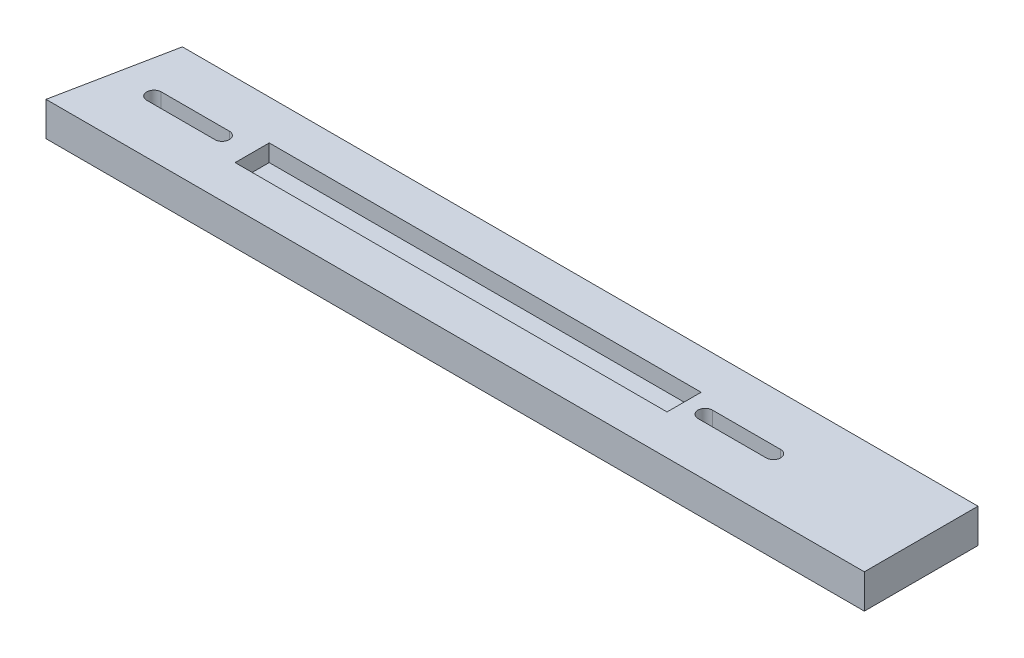
ISO-10303-21;
HEADER;
FILE_DESCRIPTION(('STEP AP214'),'2;1');
FILE_NAME('part.step','',(''),(''),'','','');
FILE_SCHEMA(('AUTOMOTIVE_DESIGN { 1 0 10303 214 1 1 1 1 }'));
ENDSEC;
DATA;
#1=APPLICATION_CONTEXT('core data for automotive mechanical design processes');
#2=APPLICATION_PROTOCOL_DEFINITION('international standard','automotive_design',2000,#1);
#3=PRODUCT_CONTEXT('',#1,'mechanical');
#4=PRODUCT('Part','Part','',(#3));
#5=PRODUCT_RELATED_PRODUCT_CATEGORY('part','',(#4));
#6=PRODUCT_DEFINITION_FORMATION('','',#4);
#7=PRODUCT_DEFINITION_CONTEXT('part definition',#1,'design');
#8=PRODUCT_DEFINITION('design','',#6,#7);
#9=PRODUCT_DEFINITION_SHAPE('','',#8);
#10=(LENGTH_UNIT() NAMED_UNIT(*) SI_UNIT(.MILLI.,.METRE.));
#11=(NAMED_UNIT(*) PLANE_ANGLE_UNIT() SI_UNIT($,.RADIAN.));
#12=(NAMED_UNIT(*) SI_UNIT($,.STERADIAN.) SOLID_ANGLE_UNIT());
#13=UNCERTAINTY_MEASURE_WITH_UNIT(LENGTH_MEASURE(1.E-05),#10,'distance_accuracy_value','');
#14=(GEOMETRIC_REPRESENTATION_CONTEXT(3) GLOBAL_UNCERTAINTY_ASSIGNED_CONTEXT((#13)) GLOBAL_UNIT_ASSIGNED_CONTEXT((#10,
#11,#12)) REPRESENTATION_CONTEXT('',''));
#15=CARTESIAN_POINT('',(0.,0.,0.));
#16=DIRECTION('',(0.,0.,1.));
#17=DIRECTION('',(1.,0.,0.));
#18=AXIS2_PLACEMENT_3D('',#15,#16,#17);
#19=CARTESIAN_POINT('',(228.6,19.05,31.75));
#20=DIRECTION('',(0.,0.,-1.));
#21=DIRECTION('',(-1.,0.,0.));
#22=AXIS2_PLACEMENT_3D('',#19,#20,#21);
#23=PLANE('',#22);
#24=DIRECTION('',(1.,0.,0.));
#25=VECTOR('',#24,1.);
#26=CARTESIAN_POINT('',(228.6,0.,31.75));
#27=LINE('',#26,#25);
#28=CARTESIAN_POINT('',(-228.6,0.,31.75));
#29=VERTEX_POINT('',#28);
#30=CARTESIAN_POINT('',(228.6,0.,31.75));
#31=VERTEX_POINT('',#30);
#32=EDGE_CURVE('E256',#29,#31,#27,.T.);
#33=ORIENTED_EDGE('',*,*,#32,.T.);
#34=DIRECTION('',(0.,-1.,0.));
#35=VECTOR('',#34,1.);
#36=CARTESIAN_POINT('',(228.6,19.05,31.75));
#37=LINE('',#36,#35);
#38=CARTESIAN_POINT('',(228.6,19.05,31.75));
#39=VERTEX_POINT('',#38);
#40=EDGE_CURVE('E42',#39,#31,#37,.T.);
#41=ORIENTED_EDGE('',*,*,#40,.F.);
#42=DIRECTION('',(1.,0.,0.));
#43=VECTOR('',#42,1.);
#44=CARTESIAN_POINT('',(228.6,19.05,31.75));
#45=LINE('',#44,#43);
#46=CARTESIAN_POINT('',(-228.6,19.05,31.75));
#47=VERTEX_POINT('',#46);
#48=EDGE_CURVE('E264',#47,#39,#45,.T.);
#49=ORIENTED_EDGE('',*,*,#48,.F.);
#50=DIRECTION('',(0.,-1.,0.));
#51=VECTOR('',#50,1.);
#52=CARTESIAN_POINT('',(-228.6,19.05,31.75));
#53=LINE('',#52,#51);
#54=EDGE_CURVE('E11',#47,#29,#53,.T.);
#55=ORIENTED_EDGE('',*,*,#54,.T.);
#56=EDGE_LOOP('',(#33,#41,#49,#55));
#57=FACE_BOUND('',#56,.T.);
#58=ADVANCED_FACE('F35',(#57),#23,.F.);
#59=CARTESIAN_POINT('',(228.6,19.05,31.75));
#60=DIRECTION('',(-1.,0.,0.));
#61=DIRECTION('',(0.,0.,1.));
#62=AXIS2_PLACEMENT_3D('',#59,#60,#61);
#63=PLANE('',#62);
#64=DIRECTION('',(0.,0.,-1.));
#65=VECTOR('',#64,1.);
#66=CARTESIAN_POINT('',(228.6,0.,31.75));
#67=LINE('',#66,#65);
#68=CARTESIAN_POINT('',(228.6,0.,-31.75));
#69=VERTEX_POINT('',#68);
#70=EDGE_CURVE('E276',#31,#69,#67,.T.);
#71=ORIENTED_EDGE('',*,*,#70,.T.);
#72=DIRECTION('',(0.,-1.,0.));
#73=VECTOR('',#72,1.);
#74=CARTESIAN_POINT('',(228.6,19.05,-31.75));
#75=LINE('',#74,#73);
#76=CARTESIAN_POINT('',(228.6,19.05,-31.75));
#77=VERTEX_POINT('',#76);
#78=EDGE_CURVE('E273',#77,#69,#75,.T.);
#79=ORIENTED_EDGE('',*,*,#78,.F.);
#80=DIRECTION('',(0.,0.,-1.));
#81=VECTOR('',#80,1.);
#82=CARTESIAN_POINT('',(228.6,19.05,31.75));
#83=LINE('',#82,#81);
#84=EDGE_CURVE('E267',#39,#77,#83,.T.);
#85=ORIENTED_EDGE('',*,*,#84,.F.);
#86=ORIENTED_EDGE('',*,*,#40,.T.);
#87=EDGE_LOOP('',(#71,#79,#85,#86));
#88=FACE_BOUND('',#87,.T.);
#89=ADVANCED_FACE('F286',(#88),#63,.F.);
#90=CARTESIAN_POINT('',(228.6,19.05,-31.75));
#91=DIRECTION('',(0.,0.,1.));
#92=DIRECTION('',(1.,0.,0.));
#93=AXIS2_PLACEMENT_3D('',#90,#91,#92);
#94=PLANE('',#93);
#95=DIRECTION('',(-1.,0.,0.));
#96=VECTOR('',#95,1.);
#97=CARTESIAN_POINT('',(228.6,0.,-31.75));
#98=LINE('',#97,#96);
#99=CARTESIAN_POINT('',(-215.9,0.,-31.75));
#100=VERTEX_POINT('',#99);
#101=EDGE_CURVE('E268',#69,#100,#98,.T.);
#102=ORIENTED_EDGE('',*,*,#101,.T.);
#103=DIRECTION('',(0.,1.,0.));
#104=VECTOR('',#103,1.);
#105=CARTESIAN_POINT('',(-215.9,0.,-31.75));
#106=LINE('',#105,#104);
#107=CARTESIAN_POINT('',(-215.9,19.05,-31.75));
#108=VERTEX_POINT('',#107);
#109=EDGE_CURVE('E57',#100,#108,#106,.T.);
#110=ORIENTED_EDGE('',*,*,#109,.T.);
#111=DIRECTION('',(-1.,0.,0.));
#112=VECTOR('',#111,1.);
#113=CARTESIAN_POINT('',(228.6,19.05,-31.75));
#114=LINE('',#113,#112);
#115=EDGE_CURVE('E270',#77,#108,#114,.T.);
#116=ORIENTED_EDGE('',*,*,#115,.F.);
#117=ORIENTED_EDGE('',*,*,#78,.T.);
#118=EDGE_LOOP('',(#102,#110,#116,#117));
#119=FACE_BOUND('',#118,.T.);
#120=ADVANCED_FACE('F295',(#119),#94,.F.);
#121=CARTESIAN_POINT('',(0.,19.05,0.));
#122=DIRECTION('',(0.,1.,0.));
#123=DIRECTION('',(0.,0.,1.));
#124=AXIS2_PLACEMENT_3D('',#121,#122,#123);
#125=PLANE('',#124);
#126=DIRECTION('',(0.,0.,1.));
#127=VECTOR('',#126,1.);
#128=CARTESIAN_POINT('',(-145.161,19.05,-9.52499999999999));
#129=LINE('',#128,#127);
#130=CARTESIAN_POINT('',(-145.161,19.05,-9.52499999999999));
#131=VERTEX_POINT('',#130);
#132=CARTESIAN_POINT('',(-145.161,19.05,9.52500000000001));
#133=VERTEX_POINT('',#132);
#134=EDGE_CURVE('E49',#131,#133,#129,.T.);
#135=ORIENTED_EDGE('',*,*,#134,.F.);
#136=DIRECTION('',(-1.,0.,0.));
#137=VECTOR('',#136,1.);
#138=CARTESIAN_POINT('',(-145.161,19.05,-9.52499999999999));
#139=LINE('',#138,#137);
#140=CARTESIAN_POINT('',(96.139,19.05,-9.52499999999999));
#141=VERTEX_POINT('',#140);
#142=EDGE_CURVE('E167',#141,#131,#139,.T.);
#143=ORIENTED_EDGE('',*,*,#142,.F.);
#144=DIRECTION('',(0.,0.,-1.));
#145=VECTOR('',#144,1.);
#146=CARTESIAN_POINT('',(96.139,19.05,-9.52499999999999));
#147=LINE('',#146,#145);
#148=CARTESIAN_POINT('',(96.139,19.05,9.52500000000001));
#149=VERTEX_POINT('',#148);
#150=EDGE_CURVE('E170',#149,#141,#147,.T.);
#151=ORIENTED_EDGE('',*,*,#150,.F.);
#152=DIRECTION('',(1.,0.,0.));
#153=VECTOR('',#152,1.);
#154=CARTESIAN_POINT('',(-145.161,19.05,9.52500000000001));
#155=LINE('',#154,#153);
#156=EDGE_CURVE('E176',#133,#149,#155,.T.);
#157=ORIENTED_EDGE('',*,*,#156,.F.);
#158=EDGE_LOOP('',(#135,#143,#151,#157));
#159=FACE_BOUND('',#158,.T.);
#160=DIRECTION('',(0.196116135138184,0.,-0.98058067569092));
#161=VECTOR('',#160,1.);
#162=CARTESIAN_POINT('',(-228.6,19.05,31.75));
#163=LINE('',#162,#161);
#164=EDGE_CURVE('E182',#47,#108,#163,.T.);
#165=ORIENTED_EDGE('',*,*,#164,.F.);
#166=ORIENTED_EDGE('',*,*,#48,.T.);
#167=ORIENTED_EDGE('',*,*,#84,.T.);
#168=ORIENTED_EDGE('',*,*,#115,.T.);
#169=EDGE_LOOP('',(#165,#166,#167,#168));
#170=FACE_BOUND('',#169,.T.);
#171=CARTESIAN_POINT('',(-200.025,19.05,0.));
#172=DIRECTION('',(0.,1.,0.));
#173=DIRECTION('',(0.,0.,1.));
#174=AXIS2_PLACEMENT_3D('',#171,#172,#173);
#175=CIRCLE('',#174,4.064);
#176=CARTESIAN_POINT('',(-200.025,19.05,-4.06399999999998));
#177=VERTEX_POINT('',#176);
#178=CARTESIAN_POINT('',(-200.025,19.05,4.06400000000003));
#179=VERTEX_POINT('',#178);
#180=EDGE_CURVE('E192',#177,#179,#175,.T.);
#181=ORIENTED_EDGE('',*,*,#180,.F.);
#182=DIRECTION('',(-1.,0.,0.));
#183=VECTOR('',#182,1.);
#184=CARTESIAN_POINT('',(-200.025,19.05,-4.06399999999998));
#185=LINE('',#184,#183);
#186=CARTESIAN_POINT('',(-161.925,19.05,-4.06399999999999));
#187=VERTEX_POINT('',#186);
#188=EDGE_CURVE('E197',#187,#177,#185,.T.);
#189=ORIENTED_EDGE('',*,*,#188,.F.);
#190=CARTESIAN_POINT('',(-161.925,19.05,0.));
#191=DIRECTION('',(0.,1.,0.));
#192=DIRECTION('',(0.,0.,1.));
#193=AXIS2_PLACEMENT_3D('',#190,#191,#192);
#194=CIRCLE('',#193,4.064);
#195=CARTESIAN_POINT('',(-161.925,19.05,4.06400000000002));
#196=VERTEX_POINT('',#195);
#197=EDGE_CURVE('E212',#196,#187,#194,.T.);
#198=ORIENTED_EDGE('',*,*,#197,.F.);
#199=DIRECTION('',(1.,0.,0.));
#200=VECTOR('',#199,1.);
#201=CARTESIAN_POINT('',(-200.025,19.05,4.06400000000003));
#202=LINE('',#201,#200);
#203=EDGE_CURVE('E209',#179,#196,#202,.T.);
#204=ORIENTED_EDGE('',*,*,#203,.F.);
#205=EDGE_LOOP('',(#181,#189,#198,#204));
#206=FACE_BOUND('',#205,.T.);
#207=CARTESIAN_POINT('',(146.05,19.05,0.));
#208=DIRECTION('',(0.,1.,0.));
#209=DIRECTION('',(0.,0.,1.));
#210=AXIS2_PLACEMENT_3D('',#207,#208,#209);
#211=CIRCLE('',#210,4.064);
#212=CARTESIAN_POINT('',(146.05,19.05,4.064));
#213=VERTEX_POINT('',#212);
#214=CARTESIAN_POINT('',(146.05,19.05,-4.064));
#215=VERTEX_POINT('',#214);
#216=EDGE_CURVE('E220',#213,#215,#211,.T.);
#217=ORIENTED_EDGE('',*,*,#216,.F.);
#218=DIRECTION('',(1.,0.,0.));
#219=VECTOR('',#218,1.);
#220=CARTESIAN_POINT('',(146.05,19.05,4.064));
#221=LINE('',#220,#219);
#222=CARTESIAN_POINT('',(107.95,19.05,4.064));
#223=VERTEX_POINT('',#222);
#224=EDGE_CURVE('E231',#223,#213,#221,.T.);
#225=ORIENTED_EDGE('',*,*,#224,.F.);
#226=CARTESIAN_POINT('',(107.95,19.05,0.));
#227=DIRECTION('',(0.,1.,0.));
#228=DIRECTION('',(0.,0.,1.));
#229=AXIS2_PLACEMENT_3D('',#226,#227,#228);
#230=CIRCLE('',#229,4.064);
#231=CARTESIAN_POINT('',(107.95,19.05,-4.06399999999999));
#232=VERTEX_POINT('',#231);
#233=EDGE_CURVE('E248',#232,#223,#230,.T.);
#234=ORIENTED_EDGE('',*,*,#233,.F.);
#235=DIRECTION('',(-1.,0.,0.));
#236=VECTOR('',#235,1.);
#237=CARTESIAN_POINT('',(146.05,19.05,-4.064));
#238=LINE('',#237,#236);
#239=EDGE_CURVE('E244',#215,#232,#238,.T.);
#240=ORIENTED_EDGE('',*,*,#239,.F.);
#241=EDGE_LOOP('',(#217,#225,#234,#240));
#242=FACE_BOUND('',#241,.T.);
#243=ADVANCED_FACE('F299',(#159,#170,#206,#242),#125,.T.);
#244=CARTESIAN_POINT('',(0.,0.,0.));
#245=DIRECTION('',(0.,1.,0.));
#246=DIRECTION('',(0.,0.,1.));
#247=AXIS2_PLACEMENT_3D('',#244,#245,#246);
#248=PLANE('',#247);
#249=DIRECTION('',(-1.,0.,0.));
#250=VECTOR('',#249,1.);
#251=CARTESIAN_POINT('',(-200.025,0.,-4.06399999999998));
#252=LINE('',#251,#250);
#253=CARTESIAN_POINT('',(-161.925,0.,-4.06399999999999));
#254=VERTEX_POINT('',#253);
#255=CARTESIAN_POINT('',(-200.025,0.,-4.06399999999998));
#256=VERTEX_POINT('',#255);
#257=EDGE_CURVE('E203',#254,#256,#252,.T.);
#258=ORIENTED_EDGE('',*,*,#257,.T.);
#259=CARTESIAN_POINT('',(-200.025,0.,0.));
#260=DIRECTION('',(0.,1.,0.));
#261=DIRECTION('',(0.,0.,1.));
#262=AXIS2_PLACEMENT_3D('',#259,#260,#261);
#263=CIRCLE('',#262,4.064);
#264=CARTESIAN_POINT('',(-200.025,0.,4.06400000000003));
#265=VERTEX_POINT('',#264);
#266=EDGE_CURVE('E193',#256,#265,#263,.T.);
#267=ORIENTED_EDGE('',*,*,#266,.T.);
#268=DIRECTION('',(1.,0.,0.));
#269=VECTOR('',#268,1.);
#270=CARTESIAN_POINT('',(-200.025,0.,4.06400000000003));
#271=LINE('',#270,#269);
#272=CARTESIAN_POINT('',(-161.925,0.,4.06400000000002));
#273=VERTEX_POINT('',#272);
#274=EDGE_CURVE('E196',#265,#273,#271,.T.);
#275=ORIENTED_EDGE('',*,*,#274,.T.);
#276=CARTESIAN_POINT('',(-161.925,0.,0.));
#277=DIRECTION('',(0.,1.,0.));
#278=DIRECTION('',(0.,0.,1.));
#279=AXIS2_PLACEMENT_3D('',#276,#277,#278);
#280=CIRCLE('',#279,4.064);
#281=EDGE_CURVE('E200',#273,#254,#280,.T.);
#282=ORIENTED_EDGE('',*,*,#281,.T.);
#283=EDGE_LOOP('',(#258,#267,#275,#282));
#284=FACE_BOUND('',#283,.T.);
#285=DIRECTION('',(1.,0.,0.));
#286=VECTOR('',#285,1.);
#287=CARTESIAN_POINT('',(146.05,0.,4.064));
#288=LINE('',#287,#286);
#289=CARTESIAN_POINT('',(107.95,0.,4.064));
#290=VERTEX_POINT('',#289);
#291=CARTESIAN_POINT('',(146.05,0.,4.064));
#292=VERTEX_POINT('',#291);
#293=EDGE_CURVE('E238',#290,#292,#288,.T.);
#294=ORIENTED_EDGE('',*,*,#293,.T.);
#295=CARTESIAN_POINT('',(146.05,0.,0.));
#296=DIRECTION('',(0.,1.,0.));
#297=DIRECTION('',(0.,0.,1.));
#298=AXIS2_PLACEMENT_3D('',#295,#296,#297);
#299=CIRCLE('',#298,4.064);
#300=CARTESIAN_POINT('',(146.05,0.,-4.064));
#301=VERTEX_POINT('',#300);
#302=EDGE_CURVE('E227',#292,#301,#299,.T.);
#303=ORIENTED_EDGE('',*,*,#302,.T.);
#304=DIRECTION('',(-1.,0.,0.));
#305=VECTOR('',#304,1.);
#306=CARTESIAN_POINT('',(146.05,0.,-4.064));
#307=LINE('',#306,#305);
#308=CARTESIAN_POINT('',(107.95,0.,-4.064));
#309=VERTEX_POINT('',#308);
#310=EDGE_CURVE('E230',#301,#309,#307,.T.);
#311=ORIENTED_EDGE('',*,*,#310,.T.);
#312=CARTESIAN_POINT('',(107.95,0.,0.));
#313=DIRECTION('',(0.,1.,0.));
#314=DIRECTION('',(0.,0.,1.));
#315=AXIS2_PLACEMENT_3D('',#312,#313,#314);
#316=CIRCLE('',#315,4.064);
#317=EDGE_CURVE('E234',#309,#290,#316,.T.);
#318=ORIENTED_EDGE('',*,*,#317,.T.);
#319=EDGE_LOOP('',(#294,#303,#311,#318));
#320=FACE_BOUND('',#319,.T.);
#321=ORIENTED_EDGE('',*,*,#32,.F.);
#322=DIRECTION('',(0.196116135138184,0.,-0.98058067569092));
#323=VECTOR('',#322,1.);
#324=CARTESIAN_POINT('',(-228.6,0.,31.75));
#325=LINE('',#324,#323);
#326=EDGE_CURVE('E187',#29,#100,#325,.T.);
#327=ORIENTED_EDGE('',*,*,#326,.T.);
#328=ORIENTED_EDGE('',*,*,#101,.F.);
#329=ORIENTED_EDGE('',*,*,#70,.F.);
#330=EDGE_LOOP('',(#321,#327,#328,#329));
#331=FACE_BOUND('',#330,.T.);
#332=ADVANCED_FACE('F293',(#284,#320,#331),#248,.F.);
#333=CARTESIAN_POINT('',(146.05,0.,0.));
#334=DIRECTION('',(0.,1.,0.));
#335=DIRECTION('',(0.,0.,1.));
#336=AXIS2_PLACEMENT_3D('',#333,#334,#335);
#337=CYLINDRICAL_SURFACE('',#336,4.064);
#338=ORIENTED_EDGE('',*,*,#216,.T.);
#339=DIRECTION('',(0.,1.,0.));
#340=VECTOR('',#339,1.);
#341=CARTESIAN_POINT('',(146.05,0.,-4.064));
#342=LINE('',#341,#340);
#343=EDGE_CURVE('E242',#301,#215,#342,.T.);
#344=ORIENTED_EDGE('',*,*,#343,.F.);
#345=ORIENTED_EDGE('',*,*,#302,.F.);
#346=DIRECTION('',(0.,1.,0.));
#347=VECTOR('',#346,1.);
#348=CARTESIAN_POINT('',(146.05,0.,4.064));
#349=LINE('',#348,#347);
#350=EDGE_CURVE('E254',#292,#213,#349,.T.);
#351=ORIENTED_EDGE('',*,*,#350,.T.);
#352=EDGE_LOOP('',(#338,#344,#345,#351));
#353=FACE_BOUND('',#352,.T.);
#354=ADVANCED_FACE('F326',(#353),#337,.F.);
#355=CARTESIAN_POINT('',(146.05,0.,4.064));
#356=DIRECTION('',(0.,0.,1.));
#357=DIRECTION('',(1.,0.,0.));
#358=AXIS2_PLACEMENT_3D('',#355,#356,#357);
#359=PLANE('',#358);
#360=ORIENTED_EDGE('',*,*,#224,.T.);
#361=ORIENTED_EDGE('',*,*,#350,.F.);
#362=ORIENTED_EDGE('',*,*,#293,.F.);
#363=DIRECTION('',(0.,1.,0.));
#364=VECTOR('',#363,1.);
#365=CARTESIAN_POINT('',(107.95,0.,4.064));
#366=LINE('',#365,#364);
#367=EDGE_CURVE('E257',#290,#223,#366,.T.);
#368=ORIENTED_EDGE('',*,*,#367,.T.);
#369=EDGE_LOOP('',(#360,#361,#362,#368));
#370=FACE_BOUND('',#369,.T.);
#371=ADVANCED_FACE('F333',(#370),#359,.F.);
#372=CARTESIAN_POINT('',(107.95,0.,0.));
#373=DIRECTION('',(0.,1.,0.));
#374=DIRECTION('',(0.,0.,1.));
#375=AXIS2_PLACEMENT_3D('',#372,#373,#374);
#376=CYLINDRICAL_SURFACE('',#375,4.064);
#377=ORIENTED_EDGE('',*,*,#233,.T.);
#378=ORIENTED_EDGE('',*,*,#367,.F.);
#379=ORIENTED_EDGE('',*,*,#317,.F.);
#380=DIRECTION('',(0.,1.,0.));
#381=VECTOR('',#380,1.);
#382=CARTESIAN_POINT('',(107.95,0.,-4.06399999999999));
#383=LINE('',#382,#381);
#384=EDGE_CURVE('E259',#309,#232,#383,.T.);
#385=ORIENTED_EDGE('',*,*,#384,.T.);
#386=EDGE_LOOP('',(#377,#378,#379,#385));
#387=FACE_BOUND('',#386,.T.);
#388=ADVANCED_FACE('F339',(#387),#376,.F.);
#389=CARTESIAN_POINT('',(146.05,0.,-4.064));
#390=DIRECTION('',(0.,0.,-1.));
#391=DIRECTION('',(-1.,0.,0.));
#392=AXIS2_PLACEMENT_3D('',#389,#390,#391);
#393=PLANE('',#392);
#394=ORIENTED_EDGE('',*,*,#239,.T.);
#395=ORIENTED_EDGE('',*,*,#384,.F.);
#396=ORIENTED_EDGE('',*,*,#310,.F.);
#397=ORIENTED_EDGE('',*,*,#343,.T.);
#398=EDGE_LOOP('',(#394,#395,#396,#397));
#399=FACE_BOUND('',#398,.T.);
#400=ADVANCED_FACE('F335',(#399),#393,.F.);
#401=CARTESIAN_POINT('',(-200.025,0.,0.));
#402=DIRECTION('',(0.,1.,0.));
#403=DIRECTION('',(0.,0.,1.));
#404=AXIS2_PLACEMENT_3D('',#401,#402,#403);
#405=CYLINDRICAL_SURFACE('',#404,4.064);
#406=ORIENTED_EDGE('',*,*,#180,.T.);
#407=DIRECTION('',(0.,1.,0.));
#408=VECTOR('',#407,1.);
#409=CARTESIAN_POINT('',(-200.025,0.,4.06400000000003));
#410=LINE('',#409,#408);
#411=EDGE_CURVE('E207',#265,#179,#410,.T.);
#412=ORIENTED_EDGE('',*,*,#411,.F.);
#413=ORIENTED_EDGE('',*,*,#266,.F.);
#414=DIRECTION('',(0.,1.,0.));
#415=VECTOR('',#414,1.);
#416=CARTESIAN_POINT('',(-200.025,0.,-4.06399999999998));
#417=LINE('',#416,#415);
#418=EDGE_CURVE('E218',#256,#177,#417,.T.);
#419=ORIENTED_EDGE('',*,*,#418,.T.);
#420=EDGE_LOOP('',(#406,#412,#413,#419));
#421=FACE_BOUND('',#420,.T.);
#422=ADVANCED_FACE('F338',(#421),#405,.F.);
#423=CARTESIAN_POINT('',(-200.025,0.,-4.06399999999998));
#424=DIRECTION('',(0.,0.,-1.));
#425=DIRECTION('',(-1.,0.,0.));
#426=AXIS2_PLACEMENT_3D('',#423,#424,#425);
#427=PLANE('',#426);
#428=ORIENTED_EDGE('',*,*,#188,.T.);
#429=ORIENTED_EDGE('',*,*,#418,.F.);
#430=ORIENTED_EDGE('',*,*,#257,.F.);
#431=DIRECTION('',(0.,1.,0.));
#432=VECTOR('',#431,1.);
#433=CARTESIAN_POINT('',(-161.925,0.,-4.06399999999999));
#434=LINE('',#433,#432);
#435=EDGE_CURVE('E221',#254,#187,#434,.T.);
#436=ORIENTED_EDGE('',*,*,#435,.T.);
#437=EDGE_LOOP('',(#428,#429,#430,#436));
#438=FACE_BOUND('',#437,.T.);
#439=ADVANCED_FACE('F348',(#438),#427,.F.);
#440=CARTESIAN_POINT('',(-161.925,0.,0.));
#441=DIRECTION('',(0.,1.,0.));
#442=DIRECTION('',(0.,0.,1.));
#443=AXIS2_PLACEMENT_3D('',#440,#441,#442);
#444=CYLINDRICAL_SURFACE('',#443,4.064);
#445=ORIENTED_EDGE('',*,*,#197,.T.);
#446=ORIENTED_EDGE('',*,*,#435,.F.);
#447=ORIENTED_EDGE('',*,*,#281,.F.);
#448=DIRECTION('',(0.,1.,0.));
#449=VECTOR('',#448,1.);
#450=CARTESIAN_POINT('',(-161.925,0.,4.06400000000002));
#451=LINE('',#450,#449);
#452=EDGE_CURVE('E223',#273,#196,#451,.T.);
#453=ORIENTED_EDGE('',*,*,#452,.T.);
#454=EDGE_LOOP('',(#445,#446,#447,#453));
#455=FACE_BOUND('',#454,.T.);
#456=ADVANCED_FACE('F311',(#455),#444,.F.);
#457=CARTESIAN_POINT('',(-200.025,0.,4.06400000000003));
#458=DIRECTION('',(0.,0.,1.));
#459=DIRECTION('',(1.,0.,0.));
#460=AXIS2_PLACEMENT_3D('',#457,#458,#459);
#461=PLANE('',#460);
#462=ORIENTED_EDGE('',*,*,#203,.T.);
#463=ORIENTED_EDGE('',*,*,#452,.F.);
#464=ORIENTED_EDGE('',*,*,#274,.F.);
#465=ORIENTED_EDGE('',*,*,#411,.T.);
#466=EDGE_LOOP('',(#462,#463,#464,#465));
#467=FACE_BOUND('',#466,.T.);
#468=ADVANCED_FACE('F303',(#467),#461,.F.);
#469=CARTESIAN_POINT('',(-228.6,0.,31.75));
#470=DIRECTION('',(0.98058067569092,0.,0.196116135138184));
#471=DIRECTION('',(0.196116135138184,0.,-0.98058067569092));
#472=AXIS2_PLACEMENT_3D('',#469,#470,#471);
#473=PLANE('',#472);
#474=ORIENTED_EDGE('',*,*,#164,.T.);
#475=ORIENTED_EDGE('',*,*,#109,.F.);
#476=ORIENTED_EDGE('',*,*,#326,.F.);
#477=ORIENTED_EDGE('',*,*,#54,.F.);
#478=EDGE_LOOP('',(#474,#475,#476,#477));
#479=FACE_BOUND('',#478,.T.);
#480=ADVANCED_FACE('F301',(#479),#473,.F.);
#481=CARTESIAN_POINT('',(-145.161,9.525,-9.52499999999999));
#482=DIRECTION('',(-1.,0.,0.));
#483=DIRECTION('',(0.,0.,1.));
#484=AXIS2_PLACEMENT_3D('',#481,#482,#483);
#485=PLANE('',#484);
#486=ORIENTED_EDGE('',*,*,#134,.T.);
#487=DIRECTION('',(0.,1.,0.));
#488=VECTOR('',#487,1.);
#489=CARTESIAN_POINT('',(-145.161,9.525,9.52500000000001));
#490=LINE('',#489,#488);
#491=CARTESIAN_POINT('',(-145.161,9.525,9.52500000000001));
#492=VERTEX_POINT('',#491);
#493=EDGE_CURVE('E145',#492,#133,#490,.T.);
#494=ORIENTED_EDGE('',*,*,#493,.F.);
#495=DIRECTION('',(0.,0.,1.));
#496=VECTOR('',#495,1.);
#497=CARTESIAN_POINT('',(-145.161,9.525,-9.52499999999999));
#498=LINE('',#497,#496);
#499=CARTESIAN_POINT('',(-145.161,9.525,-9.52499999999999));
#500=VERTEX_POINT('',#499);
#501=EDGE_CURVE('E149',#500,#492,#498,.T.);
#502=ORIENTED_EDGE('',*,*,#501,.F.);
#503=DIRECTION('',(0.,1.,0.));
#504=VECTOR('',#503,1.);
#505=CARTESIAN_POINT('',(-145.161,9.525,-9.52499999999999));
#506=LINE('',#505,#504);
#507=EDGE_CURVE('E180',#500,#131,#506,.T.);
#508=ORIENTED_EDGE('',*,*,#507,.T.);
#509=EDGE_LOOP('',(#486,#494,#502,#508));
#510=FACE_BOUND('',#509,.T.);
#511=ADVANCED_FACE('F147',(#510),#485,.F.);
#512=CARTESIAN_POINT('',(-145.161,9.525,-9.52499999999999));
#513=DIRECTION('',(0.,0.,-1.));
#514=DIRECTION('',(-1.,0.,0.));
#515=AXIS2_PLACEMENT_3D('',#512,#513,#514);
#516=PLANE('',#515);
#517=ORIENTED_EDGE('',*,*,#142,.T.);
#518=ORIENTED_EDGE('',*,*,#507,.F.);
#519=DIRECTION('',(-1.,0.,0.));
#520=VECTOR('',#519,1.);
#521=CARTESIAN_POINT('',(-145.161,9.525,-9.52499999999999));
#522=LINE('',#521,#520);
#523=CARTESIAN_POINT('',(96.139,9.525,-9.52499999999999));
#524=VERTEX_POINT('',#523);
#525=EDGE_CURVE('E155',#524,#500,#522,.T.);
#526=ORIENTED_EDGE('',*,*,#525,.F.);
#527=DIRECTION('',(0.,1.,0.));
#528=VECTOR('',#527,1.);
#529=CARTESIAN_POINT('',(96.139,9.525,-9.52499999999999));
#530=LINE('',#529,#528);
#531=EDGE_CURVE('E183',#524,#141,#530,.T.);
#532=ORIENTED_EDGE('',*,*,#531,.T.);
#533=EDGE_LOOP('',(#517,#518,#526,#532));
#534=FACE_BOUND('',#533,.T.);
#535=ADVANCED_FACE('F309',(#534),#516,.F.);
#536=CARTESIAN_POINT('',(96.139,9.525,-9.52499999999999));
#537=DIRECTION('',(1.,0.,0.));
#538=DIRECTION('',(0.,0.,-1.));
#539=AXIS2_PLACEMENT_3D('',#536,#537,#538);
#540=PLANE('',#539);
#541=ORIENTED_EDGE('',*,*,#150,.T.);
#542=ORIENTED_EDGE('',*,*,#531,.F.);
#543=DIRECTION('',(0.,0.,-1.));
#544=VECTOR('',#543,1.);
#545=CARTESIAN_POINT('',(96.139,9.525,-9.52499999999999));
#546=LINE('',#545,#544);
#547=CARTESIAN_POINT('',(96.139,9.525,9.52500000000001));
#548=VERTEX_POINT('',#547);
#549=EDGE_CURVE('E163',#548,#524,#546,.T.);
#550=ORIENTED_EDGE('',*,*,#549,.F.);
#551=DIRECTION('',(0.,1.,0.));
#552=VECTOR('',#551,1.);
#553=CARTESIAN_POINT('',(96.139,9.525,9.52500000000001));
#554=LINE('',#553,#552);
#555=EDGE_CURVE('E154',#548,#149,#554,.T.);
#556=ORIENTED_EDGE('',*,*,#555,.T.);
#557=EDGE_LOOP('',(#541,#542,#550,#556));
#558=FACE_BOUND('',#557,.T.);
#559=ADVANCED_FACE('F440',(#558),#540,.F.);
#560=CARTESIAN_POINT('',(-145.161,9.525,9.52500000000001));
#561=DIRECTION('',(0.,0.,1.));
#562=DIRECTION('',(1.,0.,0.));
#563=AXIS2_PLACEMENT_3D('',#560,#561,#562);
#564=PLANE('',#563);
#565=ORIENTED_EDGE('',*,*,#156,.T.);
#566=ORIENTED_EDGE('',*,*,#555,.F.);
#567=DIRECTION('',(1.,0.,0.));
#568=VECTOR('',#567,1.);
#569=CARTESIAN_POINT('',(-145.161,9.525,9.52500000000001));
#570=LINE('',#569,#568);
#571=EDGE_CURVE('E158',#492,#548,#570,.T.);
#572=ORIENTED_EDGE('',*,*,#571,.F.);
#573=ORIENTED_EDGE('',*,*,#493,.T.);
#574=EDGE_LOOP('',(#565,#566,#572,#573));
#575=FACE_BOUND('',#574,.T.);
#576=ADVANCED_FACE('F159',(#575),#564,.F.);
#577=CARTESIAN_POINT('',(0.,9.525,0.));
#578=DIRECTION('',(0.,1.,0.));
#579=DIRECTION('',(0.,0.,1.));
#580=AXIS2_PLACEMENT_3D('',#577,#578,#579);
#581=PLANE('',#580);
#582=ORIENTED_EDGE('',*,*,#501,.T.);
#583=ORIENTED_EDGE('',*,*,#571,.T.);
#584=ORIENTED_EDGE('',*,*,#549,.T.);
#585=ORIENTED_EDGE('',*,*,#525,.T.);
#586=EDGE_LOOP('',(#582,#583,#584,#585));
#587=FACE_BOUND('',#586,.T.);
#588=ADVANCED_FACE('F165',(#587),#581,.T.);
#589=CLOSED_SHELL('',(#58,#89,#120,#243,#332,#354,#371,#388,#400,#422,#439,#456,#468,#480,#511,
#535,#559,#576,#588));
#590=MANIFOLD_SOLID_BREP('B2',#589);
#591=ADVANCED_BREP_SHAPE_REPRESENTATION('',(#18,#590),#14);
#592=SHAPE_DEFINITION_REPRESENTATION(#9,#591);
ENDSEC;
END-ISO-10303-21;
